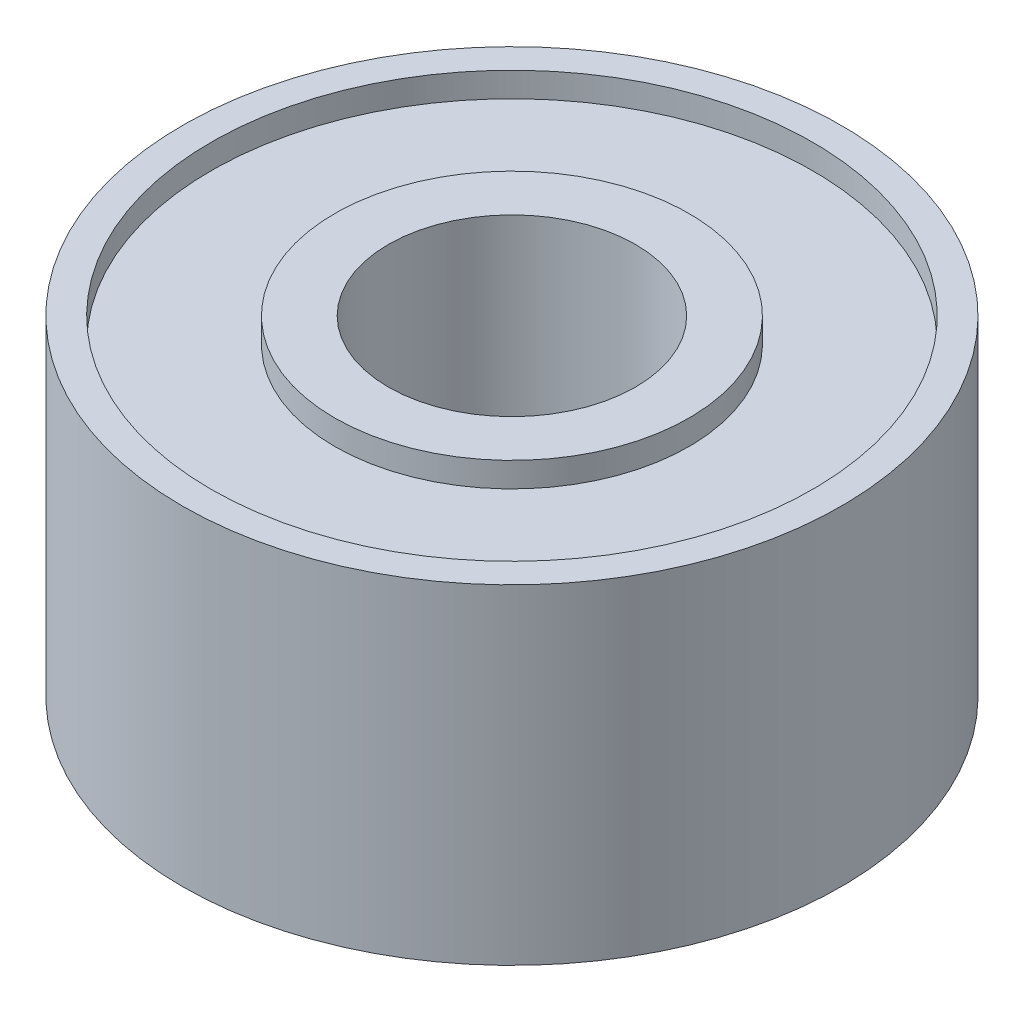
ISO-10303-21;
HEADER;
FILE_DESCRIPTION(('STEP AP214'),'2;1');
FILE_NAME('part.step','',(''),(''),'','','');
FILE_SCHEMA(('AUTOMOTIVE_DESIGN { 1 0 10303 214 1 1 1 1 }'));
ENDSEC;
DATA;
#1=APPLICATION_CONTEXT('core data for automotive mechanical design processes');
#2=APPLICATION_PROTOCOL_DEFINITION('international standard','automotive_design',2000,#1);
#3=PRODUCT_CONTEXT('',#1,'mechanical');
#4=PRODUCT('Part','Part','',(#3));
#5=PRODUCT_RELATED_PRODUCT_CATEGORY('part','',(#4));
#6=PRODUCT_DEFINITION_FORMATION('','',#4);
#7=PRODUCT_DEFINITION_CONTEXT('part definition',#1,'design');
#8=PRODUCT_DEFINITION('design','',#6,#7);
#9=PRODUCT_DEFINITION_SHAPE('','',#8);
#10=(LENGTH_UNIT() NAMED_UNIT(*) SI_UNIT(.MILLI.,.METRE.));
#11=(NAMED_UNIT(*) PLANE_ANGLE_UNIT() SI_UNIT($,.RADIAN.));
#12=(NAMED_UNIT(*) SI_UNIT($,.STERADIAN.) SOLID_ANGLE_UNIT());
#13=UNCERTAINTY_MEASURE_WITH_UNIT(LENGTH_MEASURE(1.E-05),#10,'distance_accuracy_value','');
#14=(GEOMETRIC_REPRESENTATION_CONTEXT(3) GLOBAL_UNCERTAINTY_ASSIGNED_CONTEXT((#13)) GLOBAL_UNIT_ASSIGNED_CONTEXT((#10,
#11,#12)) REPRESENTATION_CONTEXT('',''));
#15=CARTESIAN_POINT('',(0.,0.,0.));
#16=DIRECTION('',(0.,0.,1.));
#17=DIRECTION('',(1.,0.,0.));
#18=AXIS2_PLACEMENT_3D('',#15,#16,#17);
#19=CARTESIAN_POINT('',(0.,0.,0.));
#20=DIRECTION('',(0.,1.,0.));
#21=DIRECTION('',(0.,0.,1.));
#22=AXIS2_PLACEMENT_3D('',#19,#20,#21);
#23=PLANE('',#22);
#24=CARTESIAN_POINT('',(0.,0.,0.));
#25=DIRECTION('',(0.,1.,0.));
#26=DIRECTION('',(0.,0.,1.));
#27=AXIS2_PLACEMENT_3D('',#24,#25,#26);
#28=CIRCLE('',#27,1.5);
#29=CARTESIAN_POINT('',(0.,0.,1.5));
#30=VERTEX_POINT('',#29);
#31=EDGE_CURVE('E43',#30,#30,#28,.T.);
#32=ORIENTED_EDGE('',*,*,#31,.T.);
#33=EDGE_LOOP('',(#32));
#34=FACE_BOUND('',#33,.T.);
#35=CARTESIAN_POINT('',(0.,0.,0.));
#36=DIRECTION('',(0.,1.,0.));
#37=DIRECTION('',(0.,0.,1.));
#38=AXIS2_PLACEMENT_3D('',#35,#36,#37);
#39=CIRCLE('',#38,2.15);
#40=CARTESIAN_POINT('',(0.,0.,2.15));
#41=VERTEX_POINT('',#40);
#42=EDGE_CURVE('E65',#41,#41,#39,.T.);
#43=ORIENTED_EDGE('',*,*,#42,.F.);
#44=EDGE_LOOP('',(#43));
#45=FACE_BOUND('',#44,.T.);
#46=ADVANCED_FACE('F30',(#34,#45),#23,.F.);
#47=CARTESIAN_POINT('',(0.,4.,0.));
#48=DIRECTION('',(0.,1.,0.));
#49=DIRECTION('',(0.,0.,1.));
#50=AXIS2_PLACEMENT_3D('',#47,#48,#49);
#51=PLANE('',#50);
#52=CARTESIAN_POINT('',(0.,4.,0.));
#53=DIRECTION('',(0.,1.,0.));
#54=DIRECTION('',(0.,0.,1.));
#55=AXIS2_PLACEMENT_3D('',#52,#53,#54);
#56=CIRCLE('',#55,1.5);
#57=CARTESIAN_POINT('',(0.,4.,1.5));
#58=VERTEX_POINT('',#57);
#59=EDGE_CURVE('E41',#58,#58,#56,.T.);
#60=ORIENTED_EDGE('',*,*,#59,.F.);
#61=EDGE_LOOP('',(#60));
#62=FACE_BOUND('',#61,.T.);
#63=CARTESIAN_POINT('',(0.,4.,0.));
#64=DIRECTION('',(0.,1.,0.));
#65=DIRECTION('',(0.,0.,1.));
#66=AXIS2_PLACEMENT_3D('',#63,#64,#65);
#67=CIRCLE('',#66,2.15);
#68=CARTESIAN_POINT('',(0.,4.,2.15));
#69=VERTEX_POINT('',#68);
#70=EDGE_CURVE('E53',#69,#69,#67,.T.);
#71=ORIENTED_EDGE('',*,*,#70,.T.);
#72=EDGE_LOOP('',(#71));
#73=FACE_BOUND('',#72,.T.);
#74=ADVANCED_FACE('F85',(#62,#73),#51,.T.);
#75=CARTESIAN_POINT('',(0.,4.,0.));
#76=DIRECTION('',(0.,1.,0.));
#77=DIRECTION('',(0.,0.,1.));
#78=AXIS2_PLACEMENT_3D('',#75,#76,#77);
#79=CIRCLE('',#78,3.65);
#80=CARTESIAN_POINT('',(0.,4.,3.65));
#81=VERTEX_POINT('',#80);
#82=EDGE_CURVE('E49',#81,#81,#79,.T.);
#83=ORIENTED_EDGE('',*,*,#82,.F.);
#84=EDGE_LOOP('',(#83));
#85=FACE_BOUND('',#84,.T.);
#86=CARTESIAN_POINT('',(0.,4.,0.));
#87=DIRECTION('',(0.,1.,0.));
#88=DIRECTION('',(0.,0.,1.));
#89=AXIS2_PLACEMENT_3D('',#86,#87,#88);
#90=CIRCLE('',#89,4.);
#91=CARTESIAN_POINT('',(0.,4.,4.));
#92=VERTEX_POINT('',#91);
#93=EDGE_CURVE('E10',#92,#92,#90,.T.);
#94=ORIENTED_EDGE('',*,*,#93,.T.);
#95=EDGE_LOOP('',(#94));
#96=FACE_BOUND('',#95,.T.);
#97=ADVANCED_FACE('F91',(#85,#96),#51,.T.);
#98=CARTESIAN_POINT('',(0.,0.,0.));
#99=DIRECTION('',(0.,1.,0.));
#100=DIRECTION('',(0.,0.,1.));
#101=AXIS2_PLACEMENT_3D('',#98,#99,#100);
#102=CIRCLE('',#101,3.65);
#103=CARTESIAN_POINT('',(0.,0.,3.65));
#104=VERTEX_POINT('',#103);
#105=EDGE_CURVE('E61',#104,#104,#102,.T.);
#106=ORIENTED_EDGE('',*,*,#105,.T.);
#107=EDGE_LOOP('',(#106));
#108=FACE_BOUND('',#107,.T.);
#109=CARTESIAN_POINT('',(0.,0.,0.));
#110=DIRECTION('',(0.,1.,0.));
#111=DIRECTION('',(0.,0.,1.));
#112=AXIS2_PLACEMENT_3D('',#109,#110,#111);
#113=CIRCLE('',#112,4.);
#114=CARTESIAN_POINT('',(0.,0.,4.));
#115=VERTEX_POINT('',#114);
#116=EDGE_CURVE('E34',#115,#115,#113,.T.);
#117=ORIENTED_EDGE('',*,*,#116,.F.);
#118=EDGE_LOOP('',(#117));
#119=FACE_BOUND('',#118,.T.);
#120=ADVANCED_FACE('F87',(#108,#119),#23,.F.);
#121=CARTESIAN_POINT('',(0.,4.,0.));
#122=DIRECTION('',(0.,-1.,0.));
#123=DIRECTION('',(0.,0.,-1.));
#124=AXIS2_PLACEMENT_3D('',#121,#122,#123);
#125=CYLINDRICAL_SURFACE('',#124,4.);
#126=ORIENTED_EDGE('',*,*,#93,.F.);
#127=EDGE_LOOP('',(#126));
#128=FACE_BOUND('',#127,.T.);
#129=ORIENTED_EDGE('',*,*,#116,.T.);
#130=EDGE_LOOP('',(#129));
#131=FACE_BOUND('',#130,.T.);
#132=ADVANCED_FACE('F32',(#128,#131),#125,.T.);
#133=CARTESIAN_POINT('',(0.,4.,0.));
#134=DIRECTION('',(0.,-1.,0.));
#135=DIRECTION('',(0.,0.,-1.));
#136=AXIS2_PLACEMENT_3D('',#133,#134,#135);
#137=CYLINDRICAL_SURFACE('',#136,1.5);
#138=ORIENTED_EDGE('',*,*,#59,.T.);
#139=EDGE_LOOP('',(#138));
#140=FACE_BOUND('',#139,.T.);
#141=ORIENTED_EDGE('',*,*,#31,.F.);
#142=EDGE_LOOP('',(#141));
#143=FACE_BOUND('',#142,.T.);
#144=ADVANCED_FACE('F100',(#140,#143),#137,.F.);
#145=CARTESIAN_POINT('',(0.,3.7,0.));
#146=DIRECTION('',(0.,1.,0.));
#147=DIRECTION('',(0.,0.,1.));
#148=AXIS2_PLACEMENT_3D('',#145,#146,#147);
#149=CYLINDRICAL_SURFACE('',#148,2.15);
#150=CARTESIAN_POINT('',(0.,3.7,0.));
#151=DIRECTION('',(0.,1.,0.));
#152=DIRECTION('',(0.,0.,1.));
#153=AXIS2_PLACEMENT_3D('',#150,#151,#152);
#154=CIRCLE('',#153,2.15);
#155=CARTESIAN_POINT('',(0.,3.7,2.15));
#156=VERTEX_POINT('',#155);
#157=EDGE_CURVE('E52',#156,#156,#154,.T.);
#158=ORIENTED_EDGE('',*,*,#157,.T.);
#159=EDGE_LOOP('',(#158));
#160=FACE_BOUND('',#159,.T.);
#161=ORIENTED_EDGE('',*,*,#70,.F.);
#162=EDGE_LOOP('',(#161));
#163=FACE_BOUND('',#162,.T.);
#164=ADVANCED_FACE('F122',(#160,#163),#149,.T.);
#165=CARTESIAN_POINT('',(0.,3.7,0.));
#166=DIRECTION('',(0.,1.,0.));
#167=DIRECTION('',(0.,0.,1.));
#168=AXIS2_PLACEMENT_3D('',#165,#166,#167);
#169=CYLINDRICAL_SURFACE('',#168,3.65);
#170=CARTESIAN_POINT('',(0.,3.7,0.));
#171=DIRECTION('',(0.,1.,0.));
#172=DIRECTION('',(0.,0.,1.));
#173=AXIS2_PLACEMENT_3D('',#170,#171,#172);
#174=CIRCLE('',#173,3.65);
#175=CARTESIAN_POINT('',(0.,3.7,3.65));
#176=VERTEX_POINT('',#175);
#177=EDGE_CURVE('E46',#176,#176,#174,.T.);
#178=ORIENTED_EDGE('',*,*,#177,.F.);
#179=EDGE_LOOP('',(#178));
#180=FACE_BOUND('',#179,.T.);
#181=ORIENTED_EDGE('',*,*,#82,.T.);
#182=EDGE_LOOP('',(#181));
#183=FACE_BOUND('',#182,.T.);
#184=ADVANCED_FACE('F118',(#180,#183),#169,.F.);
#185=CARTESIAN_POINT('',(0.,3.7,0.));
#186=DIRECTION('',(0.,1.,0.));
#187=DIRECTION('',(0.,0.,1.));
#188=AXIS2_PLACEMENT_3D('',#185,#186,#187);
#189=PLANE('',#188);
#190=ORIENTED_EDGE('',*,*,#157,.F.);
#191=EDGE_LOOP('',(#190));
#192=FACE_BOUND('',#191,.T.);
#193=ORIENTED_EDGE('',*,*,#177,.T.);
#194=EDGE_LOOP('',(#193));
#195=FACE_BOUND('',#194,.T.);
#196=ADVANCED_FACE('F80',(#192,#195),#189,.T.);
#197=CARTESIAN_POINT('',(0.,0.3,0.));
#198=DIRECTION('',(0.,-1.,0.));
#199=DIRECTION('',(0.,0.,-1.));
#200=AXIS2_PLACEMENT_3D('',#197,#198,#199);
#201=CYLINDRICAL_SURFACE('',#200,2.15);
#202=CARTESIAN_POINT('',(0.,0.3,0.));
#203=DIRECTION('',(0.,1.,0.));
#204=DIRECTION('',(0.,0.,1.));
#205=AXIS2_PLACEMENT_3D('',#202,#203,#204);
#206=CIRCLE('',#205,2.15);
#207=CARTESIAN_POINT('',(0.,0.3,2.15));
#208=VERTEX_POINT('',#207);
#209=EDGE_CURVE('E64',#208,#208,#206,.T.);
#210=ORIENTED_EDGE('',*,*,#209,.F.);
#211=EDGE_LOOP('',(#210));
#212=FACE_BOUND('',#211,.T.);
#213=ORIENTED_EDGE('',*,*,#42,.T.);
#214=EDGE_LOOP('',(#213));
#215=FACE_BOUND('',#214,.T.);
#216=ADVANCED_FACE('F76',(#212,#215),#201,.T.);
#217=CARTESIAN_POINT('',(0.,0.3,0.));
#218=DIRECTION('',(0.,-1.,0.));
#219=DIRECTION('',(0.,0.,-1.));
#220=AXIS2_PLACEMENT_3D('',#217,#218,#219);
#221=CYLINDRICAL_SURFACE('',#220,3.65);
#222=CARTESIAN_POINT('',(0.,0.3,0.));
#223=DIRECTION('',(0.,1.,0.));
#224=DIRECTION('',(0.,0.,1.));
#225=AXIS2_PLACEMENT_3D('',#222,#223,#224);
#226=CIRCLE('',#225,3.65);
#227=CARTESIAN_POINT('',(0.,0.3,3.65));
#228=VERTEX_POINT('',#227);
#229=EDGE_CURVE('E56',#228,#228,#226,.T.);
#230=ORIENTED_EDGE('',*,*,#229,.T.);
#231=EDGE_LOOP('',(#230));
#232=FACE_BOUND('',#231,.T.);
#233=ORIENTED_EDGE('',*,*,#105,.F.);
#234=EDGE_LOOP('',(#233));
#235=FACE_BOUND('',#234,.T.);
#236=ADVANCED_FACE('F79',(#232,#235),#221,.F.);
#237=CARTESIAN_POINT('',(0.,0.3,0.));
#238=DIRECTION('',(0.,-1.,0.));
#239=DIRECTION('',(0.,0.,1.));
#240=AXIS2_PLACEMENT_3D('',#237,#238,#239);
#241=PLANE('',#240);
#242=ORIENTED_EDGE('',*,*,#209,.T.);
#243=EDGE_LOOP('',(#242));
#244=FACE_BOUND('',#243,.T.);
#245=ORIENTED_EDGE('',*,*,#229,.F.);
#246=EDGE_LOOP('',(#245));
#247=FACE_BOUND('',#246,.T.);
#248=ADVANCED_FACE('F73',(#244,#247),#241,.T.);
#249=CLOSED_SHELL('',(#46,#74,#97,#120,#132,#144,#164,#184,#196,#216,#236,#248));
#250=MANIFOLD_SOLID_BREP('B2',#249);
#251=ADVANCED_BREP_SHAPE_REPRESENTATION('',(#18,#250),#14);
#252=SHAPE_DEFINITION_REPRESENTATION(#9,#251);
ENDSEC;
END-ISO-10303-21;
